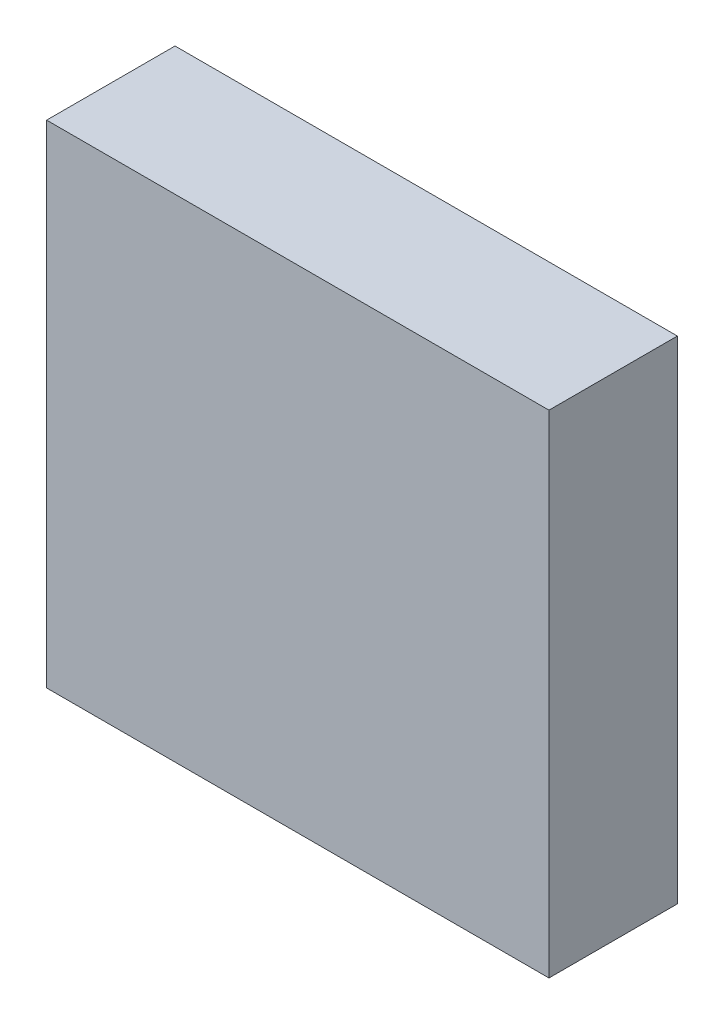
ISO-10303-21;
HEADER;
FILE_DESCRIPTION(('STEP AP214'),'2;1');
FILE_NAME('part.step','',(''),(''),'','','');
FILE_SCHEMA(('AUTOMOTIVE_DESIGN { 1 0 10303 214 1 1 1 1 }'));
ENDSEC;
DATA;
#1=APPLICATION_CONTEXT('core data for automotive mechanical design processes');
#2=APPLICATION_PROTOCOL_DEFINITION('international standard','automotive_design',2000,#1);
#3=PRODUCT_CONTEXT('',#1,'mechanical');
#4=PRODUCT('Part','Part','',(#3));
#5=PRODUCT_RELATED_PRODUCT_CATEGORY('part','',(#4));
#6=PRODUCT_DEFINITION_FORMATION('','',#4);
#7=PRODUCT_DEFINITION_CONTEXT('part definition',#1,'design');
#8=PRODUCT_DEFINITION('design','',#6,#7);
#9=PRODUCT_DEFINITION_SHAPE('','',#8);
#10=(LENGTH_UNIT() NAMED_UNIT(*) SI_UNIT(.MILLI.,.METRE.));
#11=(NAMED_UNIT(*) PLANE_ANGLE_UNIT() SI_UNIT($,.RADIAN.));
#12=(NAMED_UNIT(*) SI_UNIT($,.STERADIAN.) SOLID_ANGLE_UNIT());
#13=UNCERTAINTY_MEASURE_WITH_UNIT(LENGTH_MEASURE(1.E-05),#10,'distance_accuracy_value','');
#14=(GEOMETRIC_REPRESENTATION_CONTEXT(3) GLOBAL_UNCERTAINTY_ASSIGNED_CONTEXT((#13)) GLOBAL_UNIT_ASSIGNED_CONTEXT((#10,
#11,#12)) REPRESENTATION_CONTEXT('',''));
#15=CARTESIAN_POINT('',(0.,0.,0.));
#16=DIRECTION('',(0.,0.,1.));
#17=DIRECTION('',(1.,0.,0.));
#18=AXIS2_PLACEMENT_3D('',#15,#16,#17);
#19=CARTESIAN_POINT('',(48.1101471141447,39.6940120451133,-7.7));
#20=DIRECTION('',(0.,0.,-1.));
#21=DIRECTION('',(-1.,0.,0.));
#22=AXIS2_PLACEMENT_3D('',#19,#20,#21);
#23=PLANE('',#22);
#24=DIRECTION('',(1.,0.,0.));
#25=VECTOR('',#24,1.);
#26=CARTESIAN_POINT('',(60.0434734218307,28.0119135634819,-7.7));
#27=LINE('',#26,#25);
#28=CARTESIAN_POINT('',(36.1768208064587,28.0119135634819,-7.7));
#29=VERTEX_POINT('',#28);
#30=CARTESIAN_POINT('',(60.0434734218307,28.0119135634819,-7.7));
#31=VERTEX_POINT('',#30);
#32=EDGE_CURVE('E68',#29,#31,#27,.T.);
#33=ORIENTED_EDGE('',*,*,#32,.F.);
#34=DIRECTION('',(0.,1.,0.));
#35=VECTOR('',#34,1.);
#36=CARTESIAN_POINT('',(36.1768208064587,28.0119135634819,-7.7));
#37=LINE('',#36,#35);
#38=CARTESIAN_POINT('',(36.1768208064587,51.3761105267448,-7.7));
#39=VERTEX_POINT('',#38);
#40=EDGE_CURVE('E55',#39,#29,#37,.F.);
#41=ORIENTED_EDGE('',*,*,#40,.F.);
#42=DIRECTION('',(1.,0.,0.));
#43=VECTOR('',#42,1.);
#44=CARTESIAN_POINT('',(36.1768208064587,51.3761105267448,-7.7));
#45=LINE('',#44,#43);
#46=CARTESIAN_POINT('',(60.0434734218307,51.3761105267448,-7.7));
#47=VERTEX_POINT('',#46);
#48=EDGE_CURVE('E20',#47,#39,#45,.F.);
#49=ORIENTED_EDGE('',*,*,#48,.F.);
#50=DIRECTION('',(0.,1.,0.));
#51=VECTOR('',#50,1.);
#52=CARTESIAN_POINT('',(60.0434734218307,51.3761105267448,-7.7));
#53=LINE('',#52,#51);
#54=EDGE_CURVE('E80',#31,#47,#53,.T.);
#55=ORIENTED_EDGE('',*,*,#54,.F.);
#56=EDGE_LOOP('',(#33,#41,#49,#55));
#57=FACE_BOUND('',#56,.T.);
#58=ADVANCED_FACE('F17',(#57),#23,.T.);
#59=CARTESIAN_POINT('',(36.1768208064587,51.3761105267448,-1.6));
#60=DIRECTION('',(0.,1.,0.));
#61=DIRECTION('',(0.,0.,1.));
#62=AXIS2_PLACEMENT_3D('',#59,#60,#61);
#63=PLANE('',#62);
#64=ORIENTED_EDGE('',*,*,#48,.T.);
#65=DIRECTION('',(0.,0.,1.));
#66=VECTOR('',#65,1.);
#67=CARTESIAN_POINT('',(36.1768208064587,51.3761105267448,-1.6));
#68=LINE('',#67,#66);
#69=CARTESIAN_POINT('',(36.1768208064587,51.3761105267448,-1.6));
#70=VERTEX_POINT('',#69);
#71=EDGE_CURVE('E61',#70,#39,#68,.F.);
#72=ORIENTED_EDGE('',*,*,#71,.F.);
#73=DIRECTION('',(1.,0.,0.));
#74=VECTOR('',#73,1.);
#75=CARTESIAN_POINT('',(48.1101471141447,51.3761105267448,-1.6));
#76=LINE('',#75,#74);
#77=CARTESIAN_POINT('',(60.0434734218307,51.3761105267448,-1.6));
#78=VERTEX_POINT('',#77);
#79=EDGE_CURVE('E83',#78,#70,#76,.F.);
#80=ORIENTED_EDGE('',*,*,#79,.F.);
#81=DIRECTION('',(0.,0.,-1.));
#82=VECTOR('',#81,1.);
#83=CARTESIAN_POINT('',(60.0434734218307,51.3761105267448,-1.6));
#84=LINE('',#83,#82);
#85=EDGE_CURVE('E64',#47,#78,#84,.F.);
#86=ORIENTED_EDGE('',*,*,#85,.F.);
#87=EDGE_LOOP('',(#64,#72,#80,#86));
#88=FACE_BOUND('',#87,.T.);
#89=ADVANCED_FACE('F60',(#88),#63,.T.);
#90=CARTESIAN_POINT('',(36.1768208064587,28.0119135634819,-1.6));
#91=DIRECTION('',(-1.,0.,0.));
#92=DIRECTION('',(0.,0.,1.));
#93=AXIS2_PLACEMENT_3D('',#90,#91,#92);
#94=PLANE('',#93);
#95=ORIENTED_EDGE('',*,*,#40,.T.);
#96=DIRECTION('',(0.,0.,-1.));
#97=VECTOR('',#96,1.);
#98=CARTESIAN_POINT('',(36.1768208064587,28.0119135634819,-1.6));
#99=LINE('',#98,#97);
#100=CARTESIAN_POINT('',(36.1768208064587,28.0119135634819,-1.6));
#101=VERTEX_POINT('',#100);
#102=EDGE_CURVE('E70',#101,#29,#99,.T.);
#103=ORIENTED_EDGE('',*,*,#102,.F.);
#104=DIRECTION('',(0.,1.,0.));
#105=VECTOR('',#104,1.);
#106=CARTESIAN_POINT('',(36.1768208064587,39.6940120451133,-1.6));
#107=LINE('',#106,#105);
#108=EDGE_CURVE('E74',#70,#101,#107,.F.);
#109=ORIENTED_EDGE('',*,*,#108,.F.);
#110=ORIENTED_EDGE('',*,*,#71,.T.);
#111=EDGE_LOOP('',(#95,#103,#109,#110));
#112=FACE_BOUND('',#111,.T.);
#113=ADVANCED_FACE('F72',(#112),#94,.T.);
#114=CARTESIAN_POINT('',(60.0434734218307,28.0119135634819,-1.6));
#115=DIRECTION('',(0.,-1.,0.));
#116=DIRECTION('',(0.,0.,-1.));
#117=AXIS2_PLACEMENT_3D('',#114,#115,#116);
#118=PLANE('',#117);
#119=ORIENTED_EDGE('',*,*,#32,.T.);
#120=DIRECTION('',(0.,0.,-1.));
#121=VECTOR('',#120,1.);
#122=CARTESIAN_POINT('',(60.0434734218307,28.0119135634819,-1.6));
#123=LINE('',#122,#121);
#124=CARTESIAN_POINT('',(60.0434734218307,28.0119135634819,-1.6));
#125=VERTEX_POINT('',#124);
#126=EDGE_CURVE('E35',#125,#31,#123,.T.);
#127=ORIENTED_EDGE('',*,*,#126,.F.);
#128=DIRECTION('',(1.,0.,0.));
#129=VECTOR('',#128,1.);
#130=CARTESIAN_POINT('',(48.1101471141447,28.0119135634819,-1.6));
#131=LINE('',#130,#129);
#132=EDGE_CURVE('E26',#101,#125,#131,.T.);
#133=ORIENTED_EDGE('',*,*,#132,.F.);
#134=ORIENTED_EDGE('',*,*,#102,.T.);
#135=EDGE_LOOP('',(#119,#127,#133,#134));
#136=FACE_BOUND('',#135,.T.);
#137=ADVANCED_FACE('F89',(#136),#118,.T.);
#138=CARTESIAN_POINT('',(60.0434734218307,51.3761105267448,-1.6));
#139=DIRECTION('',(1.,0.,0.));
#140=DIRECTION('',(0.,0.,-1.));
#141=AXIS2_PLACEMENT_3D('',#138,#139,#140);
#142=PLANE('',#141);
#143=ORIENTED_EDGE('',*,*,#54,.T.);
#144=ORIENTED_EDGE('',*,*,#85,.T.);
#145=DIRECTION('',(0.,1.,0.));
#146=VECTOR('',#145,1.);
#147=CARTESIAN_POINT('',(60.0434734218307,39.6940120451133,-1.6));
#148=LINE('',#147,#146);
#149=EDGE_CURVE('E11',#125,#78,#148,.T.);
#150=ORIENTED_EDGE('',*,*,#149,.F.);
#151=ORIENTED_EDGE('',*,*,#126,.T.);
#152=EDGE_LOOP('',(#143,#144,#150,#151));
#153=FACE_BOUND('',#152,.T.);
#154=ADVANCED_FACE('F91',(#153),#142,.T.);
#155=CARTESIAN_POINT('',(48.1101471141447,39.6940120451133,-1.6));
#156=DIRECTION('',(0.,0.,1.));
#157=DIRECTION('',(1.,0.,0.));
#158=AXIS2_PLACEMENT_3D('',#155,#156,#157);
#159=PLANE('',#158);
#160=ORIENTED_EDGE('',*,*,#132,.T.);
#161=ORIENTED_EDGE('',*,*,#149,.T.);
#162=ORIENTED_EDGE('',*,*,#79,.T.);
#163=ORIENTED_EDGE('',*,*,#108,.T.);
#164=EDGE_LOOP('',(#160,#161,#162,#163));
#165=FACE_BOUND('',#164,.T.);
#166=ADVANCED_FACE('F88',(#165),#159,.T.);
#167=CLOSED_SHELL('',(#58,#89,#113,#137,#154,#166));
#168=MANIFOLD_SOLID_BREP('B1',#167);
#169=ADVANCED_BREP_SHAPE_REPRESENTATION('',(#18,#168),#14);
#170=SHAPE_DEFINITION_REPRESENTATION(#9,#169);
ENDSEC;
END-ISO-10303-21;
